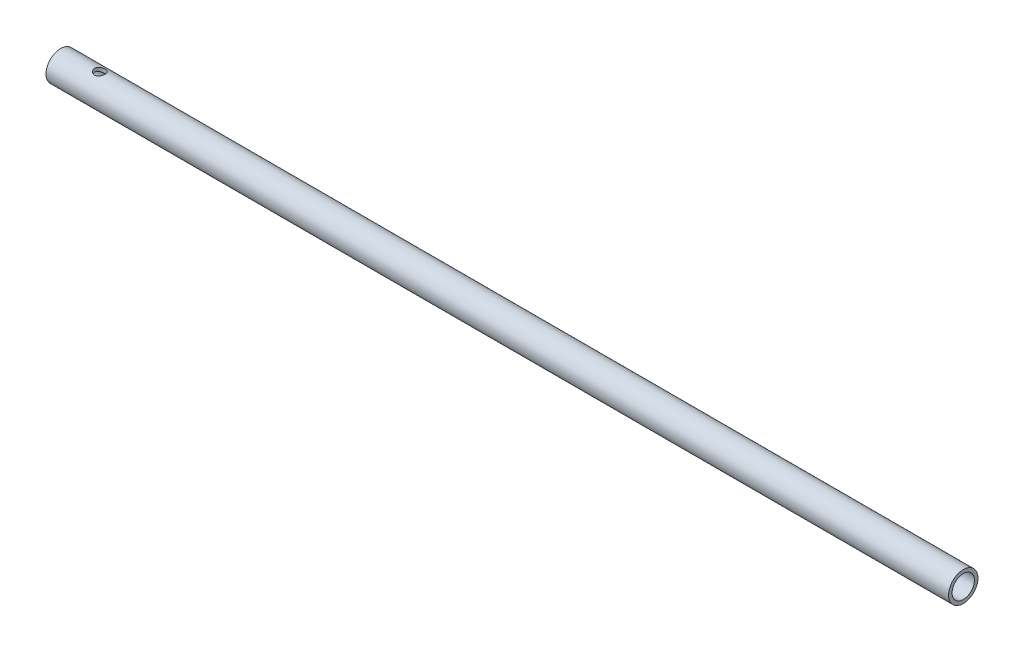
ISO-10303-21;
HEADER;
FILE_DESCRIPTION(('STEP AP214'),'2;1');
FILE_NAME('part.step','',(''),(''),'','','');
FILE_SCHEMA(('AUTOMOTIVE_DESIGN { 1 0 10303 214 1 1 1 1 }'));
ENDSEC;
DATA;
#1=APPLICATION_CONTEXT('core data for automotive mechanical design processes');
#2=APPLICATION_PROTOCOL_DEFINITION('international standard','automotive_design',2000,#1);
#3=PRODUCT_CONTEXT('',#1,'mechanical');
#4=PRODUCT('Part','Part','',(#3));
#5=PRODUCT_RELATED_PRODUCT_CATEGORY('part','',(#4));
#6=PRODUCT_DEFINITION_FORMATION('','',#4);
#7=PRODUCT_DEFINITION_CONTEXT('part definition',#1,'design');
#8=PRODUCT_DEFINITION('design','',#6,#7);
#9=PRODUCT_DEFINITION_SHAPE('','',#8);
#10=(LENGTH_UNIT() NAMED_UNIT(*) SI_UNIT(.MILLI.,.METRE.));
#11=(NAMED_UNIT(*) PLANE_ANGLE_UNIT() SI_UNIT($,.RADIAN.));
#12=(NAMED_UNIT(*) SI_UNIT($,.STERADIAN.) SOLID_ANGLE_UNIT());
#13=UNCERTAINTY_MEASURE_WITH_UNIT(LENGTH_MEASURE(1.E-05),#10,'distance_accuracy_value','');
#14=(GEOMETRIC_REPRESENTATION_CONTEXT(3) GLOBAL_UNCERTAINTY_ASSIGNED_CONTEXT((#13)) GLOBAL_UNIT_ASSIGNED_CONTEXT((#10,
#11,#12)) REPRESENTATION_CONTEXT('',''));
#15=CARTESIAN_POINT('',(0.,0.,0.));
#16=DIRECTION('',(0.,0.,1.));
#17=DIRECTION('',(1.,0.,0.));
#18=AXIS2_PLACEMENT_3D('',#15,#16,#17);
#19=CARTESIAN_POINT('',(0.,38.1,1651.));
#20=DIRECTION('',(0.,1.,0.));
#21=DIRECTION('',(0.,0.,1.));
#22=AXIS2_PLACEMENT_3D('',#19,#20,#21);
#23=CYLINDRICAL_SURFACE('',#22,3.3782);
#24=CARTESIAN_POINT('',(0.,-6.40241249530206,1647.6218));
#25=CARTESIAN_POINT('',(-0.0890182231356904,-6.4024114772284,1647.62179930281));
#26=CARTESIAN_POINT('',(-0.178023174172677,-6.40427612268818,1647.62532381059));
#27=CARTESIAN_POINT('',(-0.355334414158273,-6.41165198846957,1647.63936100384));
#28=CARTESIAN_POINT('',(-0.443640515355418,-6.41716415717875,1647.64987550677));
#29=CARTESIAN_POINT('',(-0.706637929396151,-6.43893164819147,1647.69177560318));
#30=CARTESIAN_POINT('',(-0.879371322870109,-6.4604178390989,1647.7335177177));
#31=CARTESIAN_POINT('',(-1.21372617672372,-6.51435002192829,1647.84247390298));
#32=CARTESIAN_POINT('',(-1.37539269650157,-6.54674794254052,1647.90957640497));
#33=CARTESIAN_POINT('',(-1.68521250562101,-6.6187694143654,1648.06699958884));
#34=CARTESIAN_POINT('',(-1.83336331508836,-6.65839428760147,1648.15732452003));
#35=CARTESIAN_POINT('',(-2.12354646965979,-6.74386605860283,1648.36618407342));
#36=CARTESIAN_POINT('',(-2.26439058488077,-6.78995512153549,1648.48627020436));
#37=CARTESIAN_POINT('',(-2.52484148475974,-6.88119284967937,1648.74799825145));
#38=CARTESIAN_POINT('',(-2.64443987253043,-6.92634113687537,1648.88964864951));
#39=CARTESIAN_POINT('',(-2.86564214450067,-7.01369162959671,1649.20035832633));
#40=CARTESIAN_POINT('',(-2.96583496384141,-7.05558003956582,1649.37051854904));
#41=CARTESIAN_POINT('',(-3.13564095562679,-7.12862072981494,1649.72759712724));
#42=CARTESIAN_POINT('',(-3.20527078811606,-7.15977885722785,1649.9145062857));
#43=CARTESIAN_POINT('',(-3.30743411091863,-7.20611334990599,1650.28722350547));
#44=CARTESIAN_POINT('',(-3.34203805422293,-7.22217704708911,1650.47235134123));
#45=CARTESIAN_POINT('',(-3.3799323413623,-7.23978786303808,1650.84643282893));
#46=CARTESIAN_POINT('',(-3.38323882457513,-7.24134246380426,1651.03538445865));
#47=CARTESIAN_POINT('',(-3.35936440277971,-7.23022400807418,1651.39640335739));
#48=CARTESIAN_POINT('',(-3.33448122883989,-7.21862317514511,1651.56866253696));
#49=CARTESIAN_POINT('',(-3.25897283974304,-7.18405642264455,1651.90622878341));
#50=CARTESIAN_POINT('',(-3.20834577896076,-7.16108968823443,1652.07153535093));
#51=CARTESIAN_POINT('',(-3.08230993256019,-7.1055108861731,1652.39354045546));
#52=CARTESIAN_POINT('',(-3.0065424971096,-7.07275995477103,1652.55007365971));
#53=CARTESIAN_POINT('',(-2.83280097889845,-7.00067158406996,1652.8486038405));
#54=CARTESIAN_POINT('',(-2.7348192604938,-6.96133188125137,1652.99059579441));
#55=CARTESIAN_POINT('',(-2.50980623599016,-6.87592108482548,1653.26887071941));
#56=CARTESIAN_POINT('',(-2.38101431112192,-6.82956205485926,1653.40364416756));
#57=CARTESIAN_POINT('',(-2.10285090636899,-6.73762594728449,1653.65045256351));
#58=CARTESIAN_POINT('',(-1.9534628597546,-6.69204953270743,1653.76246902522));
#59=CARTESIAN_POINT('',(-1.62890714372979,-6.60444901178298,1653.96602503103));
#60=CARTESIAN_POINT('',(-1.45282088476728,-6.56271877770001,1654.05625164757));
#61=CARTESIAN_POINT('',(-1.17769998769004,-6.50920390152831,1654.16781846068));
#62=CARTESIAN_POINT('',(-1.08420445411623,-6.4928841844046,1654.2010358619));
#63=CARTESIAN_POINT('',(-0.894150738749333,-6.46386819791863,1654.25923129239));
#64=CARTESIAN_POINT('',(-0.797593940503992,-6.45117031688186,1654.28421298723));
#65=CARTESIAN_POINT('',(-0.585379644144447,-6.42811084754546,1654.3291537489));
#66=CARTESIAN_POINT('',(-0.46929344303718,-6.41852679421297,1654.34750978705));
#67=CARTESIAN_POINT('',(-0.235487795466039,-6.40567920976522,1654.37203070072));
#68=CARTESIAN_POINT('',(-0.117768482236644,-6.4024151660622,1654.37819656491));
#69=CARTESIAN_POINT('',(0.0889454878829048,-6.40241047603113,1654.37820259672));
#70=CARTESIAN_POINT('',(0.177949990650594,-6.40427409371192,1654.37468003527));
#71=CARTESIAN_POINT('',(0.355260537169802,-6.4116478981037,1654.36064679415));
#72=CARTESIAN_POINT('',(0.443566393140602,-6.41715903360271,1654.35013429626));
#73=CARTESIAN_POINT('',(0.706563429303057,-6.43892347541832,1654.30824026182));
#74=CARTESIAN_POINT('',(0.879296992653557,-6.46040770104194,1654.26650225035));
#75=CARTESIAN_POINT('',(1.21365289602068,-6.51433634811935,1654.15755422231));
#76=CARTESIAN_POINT('',(1.3753202921554,-6.54673269680403,1654.09045577415));
#77=CARTESIAN_POINT('',(1.68514244277596,-6.61875154129532,1653.93304061995));
#78=CARTESIAN_POINT('',(1.83329471836724,-6.65837535875651,1653.84271966608));
#79=CARTESIAN_POINT('',(2.12348115605627,-6.74384545222831,1653.63386849069));
#80=CARTESIAN_POINT('',(2.26432717009804,-6.78993392833558,1653.51378680661));
#81=CARTESIAN_POINT('',(2.52478264649505,-6.88117121606891,1653.25206759033));
#82=CARTESIAN_POINT('',(2.64438371120595,-6.92631964992036,1653.11042157514));
#83=CARTESIAN_POINT('',(2.86559337614741,-7.01367164084359,1652.79971931923));
#84=CARTESIAN_POINT('',(2.96579072863358,-7.05556139620862,1652.62956194017));
#85=CARTESIAN_POINT('',(3.13560629410022,-7.12860543513074,1652.2724882653));
#86=CARTESIAN_POINT('',(3.20524116470578,-7.15976556471006,1652.08558116574));
#87=CARTESIAN_POINT('',(3.30741496151167,-7.20610453159711,1651.71286566266));
#88=CARTESIAN_POINT('',(3.34202410792714,-7.22217058328132,1651.5277374789));
#89=CARTESIAN_POINT('',(3.37992845904045,-7.2397860400527,1651.15365425381));
#90=CARTESIAN_POINT('',(3.38323980514377,-7.24134292803359,1650.9647012355));
#91=CARTESIAN_POINT('',(3.35937422398175,-7.23022857662034,1650.60367962604));
#92=CARTESIAN_POINT('',(3.33449520039526,-7.21862964557001,1650.43141917997));
#93=CARTESIAN_POINT('',(3.25899471010991,-7.18406636045632,1650.09384973896));
#94=CARTESIAN_POINT('',(3.20837139840831,-7.16110119181777,1649.92854124316));
#95=CARTESIAN_POINT('',(3.08234312061693,-7.10552531304874,1649.60653302871));
#96=CARTESIAN_POINT('',(3.0065796885234,-7.07277580640752,1649.44999854753));
#97=CARTESIAN_POINT('',(2.83284601241975,-7.00068984937467,1649.15146522868));
#98=CARTESIAN_POINT('',(2.73486813312654,-6.96135113543713,1649.00947141315));
#99=CARTESIAN_POINT('',(2.50986314427501,-6.87594192460522,1648.73119232435));
#100=CARTESIAN_POINT('',(2.38107544361919,-6.82958345100158,1648.59641648987));
#101=CARTESIAN_POINT('',(2.10292033459826,-6.73764770115197,1648.3496026122));
#102=CARTESIAN_POINT('',(1.95353636040185,-6.69207108728318,1648.23758305337));
#103=CARTESIAN_POINT('',(1.62898752643711,-6.60446891707103,1648.03401912359));
#104=CARTESIAN_POINT('',(1.4529039221055,-6.56273723202822,1647.94378784071));
#105=CARTESIAN_POINT('',(1.17778635660624,-6.50921954728783,1647.83221365303));
#106=CARTESIAN_POINT('',(1.08429180010921,-6.49289878626286,1647.79899372694));
#107=CARTESIAN_POINT('',(0.894239800082703,-6.46388053271418,1647.74079314337));
#108=CARTESIAN_POINT('',(0.79768373979328,-6.45118142907084,1647.71580882144));
#109=CARTESIAN_POINT('',(0.585444089015158,-6.4281162652885,1647.67085662912));
#110=CARTESIAN_POINT('',(0.469331004375973,-6.41852904420263,1647.65249451297));
#111=CARTESIAN_POINT('',(0.235470786825586,-6.40567808930858,1647.62796715496));
#112=CARTESIAN_POINT('',(0.117723787475579,-6.40241384167232,1647.62180092202));
#113=CARTESIAN_POINT('',(0.,-6.40241249530206,1647.6218));
#114=B_SPLINE_CURVE_WITH_KNOTS('',3,(#24,#25,#26,#27,#28,#29,#30,#31,#32,#33,#34,#35,#36,#37,
#38,#39,#40,#41,#42,#43,#44,#45,#46,#47,#48,#49,#50,#51,#52,#53,#54,#55,#56,#57,#58,#59,#60,#61,
#62,#63,#64,#65,#66,#67,#68,#69,#70,#71,#72,#73,#74,#75,#76,#77,#78,#79,#80,#81,#82,#83,#84,#85,
#86,#87,#88,#89,#90,#91,#92,#93,#94,#95,#96,#97,#98,#99,#100,#101,#102,#103,#104,#105,#106,#107,
#108,#109,#110,#111,#112,#113),.UNSPECIFIED.,.T.,.F.,(4,2,2,2,2,2,2,2,2,2,2,2,2,2,2,2,2,2,2,2,2,
2,2,2,2,2,2,2,2,2,2,2,2,2,2,2,2,2,2,2,2,2,2,2,4),(0.,0.266933265262493,0.5339359627666,
1.06805089366104,1.5998429228037,2.13173233018922,2.70152261694857,3.27153760165676,
3.8739858017796,4.47610519515429,5.04008373808632,5.60377143444725,6.12462285485295,
6.64551162129325,7.17417599678178,7.70302236461894,8.27679174174632,8.851025359182,
9.45413436904528,9.75542508148455,10.0565815131846,10.4095385806866,10.7624670202174,
11.0293986337968,11.2963997086156,11.8305115576375,12.3623005288776,12.8941868436374,
13.463972562088,14.0339830050815,14.6364316398815,15.2385515100333,15.8025344895565,
16.3662265868162,16.8870795653455,17.4079698768403,17.9366317104741,18.465475525604,
19.0392410668035,19.6134708163458,20.2165800995581,20.5178710990919,20.8190278573977,
21.1720673571715,21.5250781664529),.UNSPECIFIED.);
#115=CARTESIAN_POINT('',(0.,-6.40241249530206,1647.6218));
#116=VERTEX_POINT('',#115);
#117=EDGE_CURVE('E19',#116,#116,#114,.T.);
#118=ORIENTED_EDGE('',*,*,#117,.T.);
#119=EDGE_LOOP('',(#118));
#120=FACE_BOUND('',#119,.T.);
#121=CARTESIAN_POINT('',(0.,-8.90580651934456,1647.6218));
#122=CARTESIAN_POINT('',(-0.0915207493424671,-8.90580687149875,1647.62180056287));
#123=CARTESIAN_POINT('',(-0.183043326598945,-8.90722275509623,1647.62552482583));
#124=CARTESIAN_POINT('',(-0.36541074103425,-8.91283226406706,1647.64037247911));
#125=CARTESIAN_POINT('',(-0.456255307593295,-8.91702694426764,1647.65149867921));
#126=CARTESIAN_POINT('',(-0.726969336052,-8.93362069475261,1647.69589157635));
#127=CARTESIAN_POINT('',(-0.904923491342517,-8.95002927975293,1647.74017244301));
#128=CARTESIAN_POINT('',(-1.24982725086556,-8.99144530734925,1647.85623559238));
#129=CARTESIAN_POINT('',(-1.4168062732305,-9.01642854402305,1647.92794052243));
#130=CARTESIAN_POINT('',(-1.7363999498689,-9.0721387993984,1648.09659033487));
#131=CARTESIAN_POINT('',(-1.88901528181563,-9.10286554691892,1648.19353402567));
#132=CARTESIAN_POINT('',(-2.18236541650468,-9.16814057165193,1648.41454111693));
#133=CARTESIAN_POINT('',(-2.32236988224442,-9.20279315786763,1648.53954293788));
#134=CARTESIAN_POINT('',(-2.57994202723861,-9.27114039963637,1648.81112604522));
#135=CARTESIAN_POINT('',(-2.69750447981808,-9.30483483048679,1648.95771234452));
#136=CARTESIAN_POINT('',(-2.91024472653548,-9.36868652326264,1649.2737175879));
#137=CARTESIAN_POINT('',(-3.00464634413195,-9.39870756593504,1649.4436890257));
#138=CARTESIAN_POINT('',(-3.16322126523479,-9.45059347978661,1649.7983497467));
#139=CARTESIAN_POINT('',(-3.22740395009737,-9.47246088179424,1649.98303444138));
#140=CARTESIAN_POINT('',(-3.32120959840133,-9.50483860349646,1650.35423903012));
#141=CARTESIAN_POINT('',(-3.35208228501743,-9.51575843098858,1650.54040671194));
#142=CARTESIAN_POINT('',(-3.38238054486757,-9.52647223289373,1650.91557916461));
#143=CARTESIAN_POINT('',(-3.38181527943837,-9.52626944854844,1651.10458309289));
#144=CARTESIAN_POINT('',(-3.35001411590817,-9.51502996938617,1651.47116121887));
#145=CARTESIAN_POINT('',(-3.32013892714645,-9.50447392949925,1651.64887068097));
#146=CARTESIAN_POINT('',(-3.23283542832104,-9.47433087868727,1651.99656788003));
#147=CARTESIAN_POINT('',(-3.17540510266842,-9.45474320712517,1652.16655505113));
#148=CARTESIAN_POINT('',(-3.03390758911372,-9.40816014206071,1652.49678558165));
#149=CARTESIAN_POINT('',(-2.94947967165509,-9.38106513455802,1652.65685974895));
#150=CARTESIAN_POINT('',(-2.75669844868793,-9.32225082261101,1652.96093961409));
#151=CARTESIAN_POINT('',(-2.6483390581836,-9.29053034275756,1653.10494121115));
#152=CARTESIAN_POINT('',(-2.40406580060182,-9.22379710345894,1653.38084010188));
#153=CARTESIAN_POINT('',(-2.26700075126949,-9.18869893787227,1653.51169955307));
#154=CARTESIAN_POINT('',(-1.9726020660726,-9.12052800170189,1653.74897615972));
#155=CARTESIAN_POINT('',(-1.81525794844245,-9.08745629167944,1653.85538059524));
#156=CARTESIAN_POINT('',(-1.48083507256429,-9.02656548043368,1654.04247672514));
#157=CARTESIAN_POINT('',(-1.30344249011491,-8.99885607793933,1654.12265079404));
#158=CARTESIAN_POINT('',(-1.02855543565786,-8.9645407952887,1654.2192812088));
#159=CARTESIAN_POINT('',(-0.935503609614875,-8.95431345888475,1654.24754553709));
#160=CARTESIAN_POINT('',(-0.747076535308155,-8.93659582381654,1654.29599058897));
#161=CARTESIAN_POINT('',(-0.651702369756042,-8.92910427479281,1654.31617500581));
#162=CARTESIAN_POINT('',(-0.46393492851279,-8.91741319392304,1654.34748127864));
#163=CARTESIAN_POINT('',(-0.371613732976367,-8.9130748402957,1654.35898627579));
#164=CARTESIAN_POINT('',(-0.186243847094462,-8.90727207326498,1654.37434394635));
#165=CARTESIAN_POINT('',(-0.0931951543429634,-8.90580766937052,1654.37819659443));
#166=CARTESIAN_POINT('',(0.0913757435937301,-8.90580539055733,1654.37820334343));
#167=CARTESIAN_POINT('',(0.182897880074852,-8.90721977010388,1654.37448304397));
#168=CARTESIAN_POINT('',(0.36526479010675,-8.91282628299782,1654.35964337739));
#169=CARTESIAN_POINT('',(0.456109293031907,-8.91701947173168,1654.34852119905));
#170=CARTESIAN_POINT('',(0.726823816623503,-8.93360884420055,1654.30414038453));
#171=CARTESIAN_POINT('',(0.904779091351295,-8.95001464041329,1654.25986759213));
#172=CARTESIAN_POINT('',(1.24968642310294,-8.99142569339423,1654.14382034197));
#173=CARTESIAN_POINT('',(1.41666789581119,-9.01640674144964,1654.07212324108));
#174=CARTESIAN_POINT('',(1.73626764924811,-9.07211341923259,1653.90348872837));
#175=CARTESIAN_POINT('',(1.88888661014376,-9.10283877672024,1653.80655251261));
#176=CARTESIAN_POINT('',(2.18224500014065,-9.16811183849284,1653.58556041875));
#177=CARTESIAN_POINT('',(2.32225417477182,-9.20276388445466,1653.46056614814));
#178=CARTESIAN_POINT('',(2.57983702155133,-9.27111110500754,1653.18899758037));
#179=CARTESIAN_POINT('',(2.6974054652843,-9.30480605505424,1653.04241826821));
#180=CARTESIAN_POINT('',(2.91016019531257,-9.3686601796353,1652.72642490934));
#181=CARTESIAN_POINT('',(3.00457009281052,-9.39868312300069,1652.55645816548));
#182=CARTESIAN_POINT('',(3.16316232835591,-9.45057368687565,1652.20180537532));
#183=CARTESIAN_POINT('',(3.22735404584484,-9.47244383749691,1652.01712391717));
#184=CARTESIAN_POINT('',(3.32117823206512,-9.50482760341192,1651.64592265492));
#185=CARTESIAN_POINT('',(3.35206018510083,-9.51575063349633,1651.45975506723));
#186=CARTESIAN_POINT('',(3.38237662441227,-9.526470828054,1651.08458107184));
#187=CARTESIAN_POINT('',(3.3818202738065,-9.52627123436653,1650.89557550736));
#188=CARTESIAN_POINT('',(3.35003592438134,-9.51503765942138,1650.52899364076));
#189=CARTESIAN_POINT('',(3.32016882686283,-9.50448440606883,1650.35128212673));
#190=CARTESIAN_POINT('',(3.23288090641914,-9.47434642859258,1650.00357953423));
#191=CARTESIAN_POINT('',(3.17545806908137,-9.45476104419534,1649.83358902119));
#192=CARTESIAN_POINT('',(3.03397550195615,-9.40818209653796,1649.50335218311));
#193=CARTESIAN_POINT('',(2.94955526634951,-9.3810889742906,1649.34327492551));
#194=CARTESIAN_POINT('',(2.75678895570377,-9.32227765937115,1649.03918770886));
#195=CARTESIAN_POINT('',(2.64843679530243,-9.29055829104446,1648.89518185045));
#196=CARTESIAN_POINT('',(2.40417790042267,-9.22382641914735,1648.61927319057));
#197=CARTESIAN_POINT('',(2.26711996904141,-9.18872846122231,1648.48840815984));
#198=CARTESIAN_POINT('',(1.97273482194872,-9.12055682588464,1648.25111920405));
#199=CARTESIAN_POINT('',(1.81539712646015,-9.08748420821397,1648.14470799545));
#200=CARTESIAN_POINT('',(1.4809846625129,-9.02659011121323,1647.95759607418));
#201=CARTESIAN_POINT('',(1.30359589026201,-8.99887836520897,1647.87741323002));
#202=CARTESIAN_POINT('',(1.02871327129074,-8.9645589232538,1647.7807692197));
#203=CARTESIAN_POINT('',(0.935662671903101,-8.95433009128763,1647.75250028313));
#204=CARTESIAN_POINT('',(0.74723761443485,-8.93660930248198,1647.70404591911));
#205=CARTESIAN_POINT('',(0.651864238734405,-8.9291160959589,1647.68385680026));
#206=CARTESIAN_POINT('',(0.464047427964192,-8.91741853885669,1647.65253289081));
#207=CARTESIAN_POINT('',(0.371675316145173,-8.91307687449024,1647.64101911039));
#208=CARTESIAN_POINT('',(0.186202768332251,-8.90727068096301,1647.6256523663));
#209=CARTESIAN_POINT('',(0.0931023299844654,-8.90580616110474,1647.6217994274));
#210=CARTESIAN_POINT('',(0.,-8.90580651934456,1647.6218));
#211=B_SPLINE_CURVE_WITH_KNOTS('',3,(#121,#122,#123,#124,#125,#126,#127,#128,#129,#130,#131,
#132,#133,#134,#135,#136,#137,#138,#139,#140,#141,#142,#143,#144,#145,#146,#147,#148,#149,#150,
#151,#152,#153,#154,#155,#156,#157,#158,#159,#160,#161,#162,#163,#164,#165,#166,#167,#168,#169,
#170,#171,#172,#173,#174,#175,#176,#177,#178,#179,#180,#181,#182,#183,#184,#185,#186,#187,#188,
#189,#190,#191,#192,#193,#194,#195,#196,#197,#198,#199,#200,#201,#202,#203,#204,#205,#206,#207,
#208,#209,#210),.UNSPECIFIED.,.T.,.F.,(4,2,2,2,2,2,2,2,2,2,2,2,2,2,2,2,2,2,2,2,2,2,2,2,2,2,2,2,
2,2,2,2,2,2,2,2,2,2,2,2,2,2,2,2,4),(0.,0.274468657858002,0.549041563374095,1.09847046497821,
1.64636093546196,2.1942255437174,2.76425263237227,3.33441231702457,3.92165413944633,
4.50871353440741,5.07288722887746,5.63689651829612,6.17590383840126,6.71495059154787,
7.26152396780653,7.80823648024185,8.3837609722139,8.9595841410704,9.54616722548127,
9.83919692485865,10.1320925303455,10.4111488954285,10.6902061838122,10.9646729405918,
11.2392439991148,11.7886695778305,12.3365566636688,12.8844177900897,13.4544401678119,
14.0245951920859,14.6118376744218,15.1988977617835,15.7630762277696,16.327090257165,
16.8660990877332,17.4051473275726,17.9517173530777,18.4984265196514,19.0739471312366,
19.649766350424,20.2363508928573,20.5293815504065,20.8222781782093,21.1014890578947,
21.3807008403362),.UNSPECIFIED.);
#212=CARTESIAN_POINT('',(0.,-8.90580651934456,1647.6218));
#213=VERTEX_POINT('',#212);
#214=EDGE_CURVE('E46',#213,#213,#211,.T.);
#215=ORIENTED_EDGE('',*,*,#214,.F.);
#216=EDGE_LOOP('',(#215));
#217=FACE_BOUND('',#216,.T.);
#218=ADVANCED_FACE('F15',(#120,#217),#23,.F.);
#219=CARTESIAN_POINT('',(558.8,0.,1651.));
#220=DIRECTION('',(1.,0.,0.));
#221=DIRECTION('',(0.,0.,-1.));
#222=AXIS2_PLACEMENT_3D('',#219,#220,#221);
#223=CYLINDRICAL_SURFACE('',#222,7.239);
#224=CARTESIAN_POINT('',(558.8,0.,1651.));
#225=DIRECTION('',(1.,0.,0.));
#226=DIRECTION('',(0.,0.,-1.));
#227=AXIS2_PLACEMENT_3D('',#224,#225,#226);
#228=CIRCLE('',#227,7.239);
#229=CARTESIAN_POINT('',(558.8,0.,1643.761));
#230=VERTEX_POINT('',#229);
#231=EDGE_CURVE('E52',#230,#230,#228,.F.);
#232=ORIENTED_EDGE('',*,*,#231,.F.);
#233=EDGE_LOOP('',(#232));
#234=FACE_BOUND('',#233,.T.);
#235=CARTESIAN_POINT('',(7.21948110320981E-05,6.40241250737723,1654.37820001858));
#236=CARTESIAN_POINT('',(0.0890909398934657,6.40241249210177,1654.37819881125));
#237=CARTESIAN_POINT('',(0.178096317989105,6.40427815529703,1654.37467234748));
#238=CARTESIAN_POINT('',(0.35540821366055,6.41165607200772,1654.3606312003));
#239=CARTESIAN_POINT('',(0.443714543410932,6.41716927402387,1654.35011469922));
#240=CARTESIAN_POINT('',(0.706712362202597,6.43893981584678,1654.3082085494));
#241=CARTESIAN_POINT('',(0.879445630643445,6.46042797463861,1654.26646232148));
#242=CARTESIAN_POINT('',(1.21379948537585,6.51436370078216,1654.15749795897));
#243=CARTESIAN_POINT('',(1.37546513634944,6.54676319614647,1654.09039139845));
#244=CARTESIAN_POINT('',(1.68528260221654,6.61878729712518,1653.93296018041));
#245=CARTESIAN_POINT('',(1.83343193761739,6.65841322440596,1653.84263127443));
#246=CARTESIAN_POINT('',(2.12361179984516,6.74388667074686,1653.6337633463));
#247=CARTESIAN_POINT('',(2.26445401432698,6.78997632016535,1653.51367276848));
#248=CARTESIAN_POINT('',(2.52490033636585,6.88121448862966,1653.25193588852));
#249=CARTESIAN_POINT('',(2.64449604741587,6.92636262940267,1653.11028110521));
#250=CARTESIAN_POINT('',(2.86569092495601,7.01371162358806,1652.79956400417));
#251=CARTESIAN_POINT('',(2.96587920974253,7.05559868765651,1652.62940093711));
#252=CARTESIAN_POINT('',(3.13567562477539,7.12863602800188,1652.27231745472));
#253=CARTESIAN_POINT('',(3.20530041753191,7.15979215253867,1652.08540623721));
#254=CARTESIAN_POINT('',(3.30745326329907,7.20612216962408,1651.71268730086));
#255=CARTESIAN_POINT('',(3.34205200207985,7.22218351164029,1651.52755981332));
#256=CARTESIAN_POINT('',(3.37993622252239,7.23978968548295,1651.15348006382));
#257=CARTESIAN_POINT('',(3.38323784155636,7.24134199842664,1650.96452982331));
#258=CARTESIAN_POINT('',(3.35935457678558,7.23021943730834,1650.60351363617));
#259=CARTESIAN_POINT('',(3.33446725134296,7.21861670199009,1650.43125572336));
#260=CARTESIAN_POINT('',(3.25895096124544,7.18404648119122,1650.09369267235));
#261=CARTESIAN_POINT('',(3.20832015037493,7.16107818062275,1649.92838803375));
#262=CARTESIAN_POINT('',(3.08227673374635,7.10549645474852,1649.60638604137));
#263=CARTESIAN_POINT('',(3.00650529445892,7.07274409850813,1649.44985411561));
#264=CARTESIAN_POINT('',(2.83275593217144,7.00065331364771,1649.15132707363));
#265=CARTESIAN_POINT('',(2.734770372825,6.96131262143329,1649.00933698075));
#266=CARTESIAN_POINT('',(2.50974930407228,6.87590023671048,1648.73106621309));
#267=CARTESIAN_POINT('',(2.38095314729437,6.82954064805566,1648.59629514623));
#268=CARTESIAN_POINT('',(2.10278144227675,6.73760418299139,1648.34949223597));
#269=CARTESIAN_POINT('',(1.95338932832966,6.69202797019127,1648.23747887825));
#270=CARTESIAN_POINT('',(1.62882677665429,6.60442911201426,1648.03393082861));
#271=CARTESIAN_POINT('',(1.45273790837097,6.56270033862006,1647.94370889819));
#272=CARTESIAN_POINT('',(1.17761370874306,6.50918827317285,1647.83214946146));
#273=CARTESIAN_POINT('',(1.08411718053698,6.49286959612618,1647.79893457659));
#274=CARTESIAN_POINT('',(0.894061711527615,6.46385586815329,1647.74074428239));
#275=CARTESIAN_POINT('',(0.797504154221459,6.45115920541067,1647.71576520731));
#276=CARTESIAN_POINT('',(0.585291781753734,6.42810288834936,1647.67083091815));
#277=CARTESIAN_POINT('',(0.469208405238369,6.41852063147576,1647.65247841121));
#278=CARTESIAN_POINT('',(0.235408873458949,6.40567636279113,1647.62796390606));
#279=CARTESIAN_POINT('',(0.117692851355724,6.40241383855172,1647.62180091947));
#280=CARTESIAN_POINT('',(-0.0890181859087606,6.40241147932151,1647.62179930455));
#281=CARTESIAN_POINT('',(-0.178023116279669,6.40427612210208,1647.62532380887));
#282=CARTESIAN_POINT('',(-0.355334318964812,6.41165198268433,1647.63936099343));
#283=CARTESIAN_POINT('',(-0.44364040342737,6.41716414936917,1647.64987549207));
#284=CARTESIAN_POINT('',(-0.706637843808546,6.43893163822423,1647.69177558332));
#285=CARTESIAN_POINT('',(-0.879371281818471,6.46041783267846,1647.73351770458));
#286=CARTESIAN_POINT('',(-1.21372618544514,6.51435002313466,1647.84247390556));
#287=CARTESIAN_POINT('',(-1.37539271247424,6.54674794568545,1647.90957641152));
#288=CARTESIAN_POINT('',(-1.6852125199767,6.6187694182719,1648.0669995977));
#289=CARTESIAN_POINT('',(-1.83336332189755,6.65839428962634,1648.15732452496));
#290=CARTESIAN_POINT('',(-2.12354646847152,6.74386605823219,1648.36618407253));
#291=CARTESIAN_POINT('',(-2.26439058259858,6.78995512078304,1648.4862702024));
#292=CARTESIAN_POINT('',(-2.52484148280648,6.88119284894797,1648.74799824915));
#293=CARTESIAN_POINT('',(-2.6444398716548,6.92634113653131,1648.88964864828));
#294=CARTESIAN_POINT('',(-2.86564214455637,7.01369162961689,1649.2003583264));
#295=CARTESIAN_POINT('',(-2.96583496393329,7.05558003960367,1649.3705185492));
#296=CARTESIAN_POINT('',(-3.13564095568884,7.12862072984329,1649.72759712741));
#297=CARTESIAN_POINT('',(-3.20527078813966,7.15977885723873,1649.91450628579));
#298=CARTESIAN_POINT('',(-3.30743411093994,7.20611334991549,1650.28722350554));
#299=CARTESIAN_POINT('',(-3.34203805425257,7.22217704710275,1650.47235134138));
#300=CARTESIAN_POINT('',(-3.37993234136521,7.23978786303958,1650.84643282909));
#301=CARTESIAN_POINT('',(-3.38323882456971,7.24134246380186,1651.03538445873));
#302=CARTESIAN_POINT('',(-3.35936440277157,7.23022400807028,1651.39640335752));
#303=CARTESIAN_POINT('',(-3.3344812288046,7.21862317512835,1651.56866253721));
#304=CARTESIAN_POINT('',(-3.25897283966935,7.18405642261142,1651.90622878365));
#305=CARTESIAN_POINT('',(-3.20834577891285,7.16108968821416,1652.07153535104));
#306=CARTESIAN_POINT('',(-3.08230993307316,7.10551088639843,1652.39354045416));
#307=CARTESIAN_POINT('',(-3.006542498338,7.0727599552989,1652.55007365719));
#308=CARTESIAN_POINT('',(-2.83280098046988,7.00067158470375,1652.84860383821));
#309=CARTESIAN_POINT('',(-2.7348192613364,6.96133188158287,1652.99059579332));
#310=CARTESIAN_POINT('',(-2.50980623041918,6.87592108269817,1653.26887072634));
#311=CARTESIAN_POINT('',(-2.38101429891527,6.82956205041804,1653.40364418048));
#312=CARTESIAN_POINT('',(-2.1028508919031,6.73762594291088,1653.65045257426));
#313=CARTESIAN_POINT('',(-1.95346285162241,6.69204953063719,1653.76246902998));
#314=CARTESIAN_POINT('',(-1.62890718409155,6.60444902254599,1653.96602500607));
#315=CARTESIAN_POINT('',(-1.45282097123689,6.56271879776529,1654.05625160437));
#316=CARTESIAN_POINT('',(-1.17770010380363,6.50920392248513,1654.16781841767));
#317=CARTESIAN_POINT('',(-1.08420455258174,6.49288420098848,1654.20103582806));
#318=CARTESIAN_POINT('',(-0.894150798786629,6.46386820553671,1654.25923127769));
#319=CARTESIAN_POINT('',(-0.797593979407288,6.45117032031471,1654.28421298157));
#320=CARTESIAN_POINT('',(-0.58535624469905,6.4281083058639,1654.32915870119));
#321=CARTESIAN_POINT('',(-0.469245976742931,6.41852287806132,1654.34751728269));
#322=CARTESIAN_POINT('',(-0.235391859865013,6.40567524576271,1654.37203824428));
#323=CARTESIAN_POINT('',(-0.11764814443562,6.40241252757784,1654.37820161517));
#324=CARTESIAN_POINT('',(7.21948110320981E-05,6.40241250737723,1654.37820001858));
#325=B_SPLINE_CURVE_WITH_KNOTS('',3,(#235,#236,#237,#238,#239,#240,#241,#242,#243,#244,#245,
#246,#247,#248,#249,#250,#251,#252,#253,#254,#255,#256,#257,#258,#259,#260,#261,#262,#263,#264,
#265,#266,#267,#268,#269,#270,#271,#272,#273,#274,#275,#276,#277,#278,#279,#280,#281,#282,#283,
#284,#285,#286,#287,#288,#289,#290,#291,#292,#293,#294,#295,#296,#297,#298,#299,#300,#301,#302,
#303,#304,#305,#306,#307,#308,#309,#310,#311,#312,#313,#314,#315,#316,#317,#318,#319,#320,#321,
#322,#323,#324),.UNSPECIFIED.,.T.,.F.,(4,2,2,2,2,2,2,2,2,2,2,2,2,2,2,2,2,2,2,2,2,2,2,2,2,2,2,2,
2,2,2,2,2,2,2,2,2,2,2,2,2,2,2,2,4),(0.,0.266934833403639,0.533939107451154,1.06805725155043,
1.59985236744558,2.13174484285413,2.70153969399102,3.27155922656414,3.87400699181319,
4.47612590730898,5.04010001258391,5.60378330658014,6.12463316909765,6.64552039006876,
7.17418730431667,7.70303622990141,8.27680947088601,8.85104693031551,9.45415552292331,
9.75544600254015,10.05660219633,10.4095488970267,10.7624669782404,11.0294001606908,
11.2964028116453,11.8305178715451,12.3623099266341,12.8941993080677,13.4639895902077,
14.034004579535,14.6364527799298,15.2385721730326,15.8025507162054,16.3662384123256,
16.8870898331059,17.4079785991716,17.9366429704132,18.465489342498,19.0392587470533,
19.613492337062,20.2166012026881,20.5178919704585,20.819048491488,21.1720776478421,
21.5250781211236),.UNSPECIFIED.);
#326=CARTESIAN_POINT('',(7.21948110320981E-05,6.40241250737723,1654.37820001858));
#327=VERTEX_POINT('',#326);
#328=EDGE_CURVE('E76',#327,#327,#325,.T.);
#329=ORIENTED_EDGE('',*,*,#328,.T.);
#330=EDGE_LOOP('',(#329));
#331=FACE_BOUND('',#330,.T.);
#332=CARTESIAN_POINT('',(-25.4,0.,1651.));
#333=DIRECTION('',(1.,0.,0.));
#334=DIRECTION('',(0.,0.,-1.));
#335=AXIS2_PLACEMENT_3D('',#332,#333,#334);
#336=CIRCLE('',#335,7.239);
#337=CARTESIAN_POINT('',(-25.4,0.,1643.761));
#338=VERTEX_POINT('',#337);
#339=EDGE_CURVE('E51',#338,#338,#336,.F.);
#340=ORIENTED_EDGE('',*,*,#339,.T.);
#341=EDGE_LOOP('',(#340));
#342=FACE_BOUND('',#341,.T.);
#343=ORIENTED_EDGE('',*,*,#117,.F.);
#344=EDGE_LOOP('',(#343));
#345=FACE_BOUND('',#344,.T.);
#346=ADVANCED_FACE('F62',(#234,#331,#342,#345),#223,.F.);
#347=CARTESIAN_POINT('',(558.8,0.,1905.));
#348=DIRECTION('',(1.,0.,0.));
#349=DIRECTION('',(0.,0.,-1.));
#350=AXIS2_PLACEMENT_3D('',#347,#348,#349);
#351=PLANE('',#350);
#352=ORIENTED_EDGE('',*,*,#231,.T.);
#353=EDGE_LOOP('',(#352));
#354=FACE_BOUND('',#353,.T.);
#355=CARTESIAN_POINT('',(558.8,0.,1651.));
#356=DIRECTION('',(1.,0.,0.));
#357=DIRECTION('',(0.,0.,-1.));
#358=AXIS2_PLACEMENT_3D('',#355,#356,#357);
#359=CIRCLE('',#358,9.525);
#360=CARTESIAN_POINT('',(558.8,0.,1641.475));
#361=VERTEX_POINT('',#360);
#362=EDGE_CURVE('E30',#361,#361,#359,.F.);
#363=ORIENTED_EDGE('',*,*,#362,.F.);
#364=EDGE_LOOP('',(#363));
#365=FACE_BOUND('',#364,.T.);
#366=ADVANCED_FACE('F64',(#354,#365),#351,.T.);
#367=CARTESIAN_POINT('',(-25.4,0.,1905.));
#368=DIRECTION('',(1.,0.,0.));
#369=DIRECTION('',(0.,0.,-1.));
#370=AXIS2_PLACEMENT_3D('',#367,#368,#369);
#371=PLANE('',#370);
#372=ORIENTED_EDGE('',*,*,#339,.F.);
#373=EDGE_LOOP('',(#372));
#374=FACE_BOUND('',#373,.T.);
#375=CARTESIAN_POINT('',(-25.4,0.,1651.));
#376=DIRECTION('',(1.,0.,0.));
#377=DIRECTION('',(0.,0.,-1.));
#378=AXIS2_PLACEMENT_3D('',#375,#376,#377);
#379=CIRCLE('',#378,9.525);
#380=CARTESIAN_POINT('',(-25.4,0.,1641.475));
#381=VERTEX_POINT('',#380);
#382=EDGE_CURVE('E25',#381,#381,#379,.T.);
#383=ORIENTED_EDGE('',*,*,#382,.F.);
#384=EDGE_LOOP('',(#383));
#385=FACE_BOUND('',#384,.T.);
#386=ADVANCED_FACE('F71',(#374,#385),#371,.F.);
#387=CARTESIAN_POINT('',(0.,38.1,1651.));
#388=DIRECTION('',(0.,1.,0.));
#389=DIRECTION('',(0.,0.,1.));
#390=AXIS2_PLACEMENT_3D('',#387,#388,#389);
#391=CYLINDRICAL_SURFACE('',#390,3.3782);
#392=ORIENTED_EDGE('',*,*,#328,.F.);
#393=EDGE_LOOP('',(#392));
#394=FACE_BOUND('',#393,.T.);
#395=CARTESIAN_POINT('',(0.000144388852038666,8.90580652051503,1654.37819999691));
#396=CARTESIAN_POINT('',(-0.091375710622921,8.90580539022063,1654.37820334432));
#397=CARTESIAN_POINT('',(-0.182897847008367,8.90721976942542,1654.37448304576));
#398=CARTESIAN_POINT('',(-0.365264756933903,8.9128262816387,1654.359643381));
#399=CARTESIAN_POINT('',(-0.456109259848393,8.91701947003373,1654.34852120356));
#400=CARTESIAN_POINT('',(-0.726823783546829,8.93360884150731,1654.30414039179));
#401=CARTESIAN_POINT('',(-0.90477905851936,8.95001463708518,1654.25986760123));
#402=CARTESIAN_POINT('',(-1.2496863910721,8.9914256889334,1654.14382035469));
#403=CARTESIAN_POINT('',(-1.41666786433574,9.01640673649068,1654.07212325559));
#404=CARTESIAN_POINT('',(-1.73626761915506,9.07211341345979,1653.90348874635));
#405=CARTESIAN_POINT('',(-1.88888658087795,9.10283877063164,1653.80655253229));
#406=CARTESIAN_POINT('',(-2.18224497275428,9.16811183195821,1653.58556044184));
#407=CARTESIAN_POINT('',(-2.3222541484566,9.2027638777972,1653.46056617295));
#408=CARTESIAN_POINT('',(-2.57983699766978,9.27111109834516,1653.18899760849));
#409=CARTESIAN_POINT('',(-2.69740544276498,9.30480604850983,1653.04241829792));
#410=CARTESIAN_POINT('',(-2.91016017608679,9.36866017364378,1652.72642494175));
#411=CARTESIAN_POINT('',(-3.00457007546773,9.39868311744139,1652.55645819895));
#412=CARTESIAN_POINT('',(-3.1631623149509,9.45057368237385,1652.2018054106));
#413=CARTESIAN_POINT('',(-3.22735403449416,9.47244383362023,1652.01712395318));
#414=CARTESIAN_POINT('',(-3.32117822493061,9.50482760090988,1651.64592269169));
#415=CARTESIAN_POINT('',(-3.35206018007381,9.51575063172265,1651.45975510402));
#416=CARTESIAN_POINT('',(-3.38237662351976,9.52647082773418,1651.08458110828));
#417=CARTESIAN_POINT('',(-3.3818202749415,9.52627123477236,1650.89557554343));
#418=CARTESIAN_POINT('',(-3.35003592934045,9.51503766117005,1650.52899367598));
#419=CARTESIAN_POINT('',(-3.32016883366216,9.50448440845126,1650.35128216148));
#420=CARTESIAN_POINT('',(-3.23288091676148,9.47434643212887,1650.00357956776));
#421=CARTESIAN_POINT('',(-3.17545808112676,9.4547610482518,1649.83358905396));
#422=CARTESIAN_POINT('',(-3.03397551740064,9.40818210153082,1649.50335221444));
#423=CARTESIAN_POINT('',(-2.9495552835409,9.38108897971218,1649.34327495614));
#424=CARTESIAN_POINT('',(-2.75678897628653,9.32227766547436,1649.03918773782));
#425=CARTESIAN_POINT('',(-2.6484368175297,9.29055829740054,1648.89518187844));
#426=CARTESIAN_POINT('',(-2.40417792591807,9.22382642581491,1648.61927321634));
#427=CARTESIAN_POINT('',(-2.26711999615735,9.18872846793755,1648.48840818434));
#428=CARTESIAN_POINT('',(-1.97273485214423,9.12055683244092,1648.25111922575));
#429=CARTESIAN_POINT('',(-1.81539715811471,9.08748421456347,1648.1447080156));
#430=CARTESIAN_POINT('',(-1.48098469652535,9.02659011681371,1647.95759609073));
#431=CARTESIAN_POINT('',(-1.3035959251318,8.99887837027531,1647.87741324457));
#432=CARTESIAN_POINT('',(-1.02871330716351,8.96455892737423,1647.78076923117));
#433=CARTESIAN_POINT('',(-0.935662708058455,8.95433009506852,1647.75250029355));
#434=CARTESIAN_POINT('',(-0.747237651056853,8.93660930554685,1647.70404592742));
#435=CARTESIAN_POINT('',(-0.651864275540449,8.92911609864737,1647.68385680749));
#436=CARTESIAN_POINT('',(-0.464047458936038,8.91741854040774,1647.65253289493));
#437=CARTESIAN_POINT('',(-0.371675341009568,8.91307687546288,1647.64101911297));
#438=CARTESIAN_POINT('',(-0.186202780835838,8.90727068116021,1647.62565236682));
#439=CARTESIAN_POINT('',(-0.0931023362347,8.90580616110489,1647.6217994274));
#440=CARTESIAN_POINT('',(0.0915207493503003,8.90580687149859,1647.62180056287));
#441=CARTESIAN_POINT('',(0.183043326611353,8.90722275509637,1647.62552482583));
#442=CARTESIAN_POINT('',(0.365410741055029,8.91283226406794,1647.64037247912));
#443=CARTESIAN_POINT('',(0.456255307617888,8.91702694426888,1647.65149867922));
#444=CARTESIAN_POINT('',(0.726969336070868,8.93362069475428,1647.69589157636));
#445=CARTESIAN_POINT('',(0.904923491351587,8.95002927975399,1647.74017244302));
#446=CARTESIAN_POINT('',(1.24982725086335,8.99144530734901,1647.85623559238));
#447=CARTESIAN_POINT('',(1.41680627322638,9.01642854402244,1647.92794052243));
#448=CARTESIAN_POINT('',(1.73639994986519,9.07213879939765,1648.09659033486));
#449=CARTESIAN_POINT('',(1.88901528181388,9.10286554691853,1648.19353402567));
#450=CARTESIAN_POINT('',(2.18236541650506,9.16814057165202,1648.41454111694));
#451=CARTESIAN_POINT('',(2.32236988224514,9.2027931578678,1648.53954293788));
#452=CARTESIAN_POINT('',(2.57994202723922,9.27114039963654,1648.81112604522));
#453=CARTESIAN_POINT('',(2.69750447981835,9.30483483048687,1648.95771234452));
#454=CARTESIAN_POINT('',(2.91024472653544,9.36868652326263,1649.2737175879));
#455=CARTESIAN_POINT('',(3.00464634413187,9.39870756593502,1649.4436890257));
#456=CARTESIAN_POINT('',(3.16322126523474,9.4505934797866,1649.7983497467));
#457=CARTESIAN_POINT('',(3.22740395009735,9.47246088179424,1649.98303444138));
#458=CARTESIAN_POINT('',(3.32120959840133,9.50483860349646,1650.35423903012));
#459=CARTESIAN_POINT('',(3.35208228501743,9.51575843098858,1650.54040671194));
#460=CARTESIAN_POINT('',(3.38238054486757,9.52647223289373,1650.91557916461));
#461=CARTESIAN_POINT('',(3.38181527943838,9.52626944854844,1651.10458309289));
#462=CARTESIAN_POINT('',(3.35001411590817,9.51502996938617,1651.47116121887));
#463=CARTESIAN_POINT('',(3.32013892714646,9.50447392949926,1651.64887068097));
#464=CARTESIAN_POINT('',(3.23283542832111,9.47433087868729,1651.99656788003));
#465=CARTESIAN_POINT('',(3.17540510266848,9.45474320712519,1652.16655505113));
#466=CARTESIAN_POINT('',(3.03390758911357,9.40816014206066,1652.49678558165));
#467=CARTESIAN_POINT('',(2.94947967165471,9.3810651345579,1652.65685974895));
#468=CARTESIAN_POINT('',(2.75669844868745,9.32225082261087,1652.96093961409));
#469=CARTESIAN_POINT('',(2.64833905818336,9.29053034275749,1653.10494121115));
#470=CARTESIAN_POINT('',(2.40406580060321,9.22379710345932,1653.38084010187));
#471=CARTESIAN_POINT('',(2.26700075127251,9.18869893787305,1653.51169955307));
#472=CARTESIAN_POINT('',(1.97260206607611,9.12052800170262,1653.74897615972));
#473=CARTESIAN_POINT('',(1.81525794844438,9.08745629167978,1653.85538059524));
#474=CARTESIAN_POINT('',(1.48083507255595,9.02656548043219,1654.04247672514));
#475=CARTESIAN_POINT('',(1.30344249009721,8.99885607793663,1654.12265079405));
#476=CARTESIAN_POINT('',(1.02855543563429,8.964540795286,1654.21928120881));
#477=CARTESIAN_POINT('',(0.935503609594923,8.95431345888264,1654.24754553709));
#478=CARTESIAN_POINT('',(0.747076535296111,8.93659582381564,1654.29599058897));
#479=CARTESIAN_POINT('',(0.65170236974834,8.92910427479247,1654.31617500581));
#480=CARTESIAN_POINT('',(0.46393493389888,8.91741319425826,1654.34748127775));
#481=CARTESIAN_POINT('',(0.371613743834867,8.91307484080558,1654.35898627444));
#482=CARTESIAN_POINT('',(0.186243868940536,8.9072720737789,1654.37434394499));
#483=CARTESIAN_POINT('',(0.0931951817041922,8.90580766971386,1654.37819659353));
#484=CARTESIAN_POINT('',(0.000144388852038666,8.90580652051503,1654.37819999691));
#485=B_SPLINE_CURVE_WITH_KNOTS('',3,(#395,#396,#397,#398,#399,#400,#401,#402,#403,#404,#405,
#406,#407,#408,#409,#410,#411,#412,#413,#414,#415,#416,#417,#418,#419,#420,#421,#422,#423,#424,
#425,#426,#427,#428,#429,#430,#431,#432,#433,#434,#435,#436,#437,#438,#439,#440,#441,#442,#443,
#444,#445,#446,#447,#448,#449,#450,#451,#452,#453,#454,#455,#456,#457,#458,#459,#460,#461,#462,
#463,#464,#465,#466,#467,#468,#469,#470,#471,#472,#473,#474,#475,#476,#477,#478,#479,#480,#481,
#482,#483,#484),.UNSPECIFIED.,.T.,.F.,(4,2,2,2,2,2,2,2,2,2,2,2,2,2,2,2,2,2,2,2,2,2,2,2,2,2,2,2,
2,2,2,2,2,2,2,2,2,2,2,2,2,2,2,2,4),(0.,0.274466756365097,0.549037814478851,1.09846339241036,
1.64635047747229,2.19421160310808,2.76423397976007,3.33438900297271,3.92163148545831,
4.50869157297768,5.07287004004965,5.63688407052251,6.17589290143429,6.71494114161198,
7.26151116635621,7.80822033216803,8.38374094286415,8.95956016115937,9.54614470395281,
9.83917536170893,10.1320719897265,10.4112828881523,10.6904946893324,10.9649633472082,
11.239536252735,11.7889651543106,12.3368556247877,12.8847202330498,13.4547473217062,
14.024907006357,14.6121488287785,15.1992082237398,15.7633819182099,16.3273912076286,
16.8663985277332,17.4054452808803,17.95201865714,18.4987311695743,19.0742556615399,
19.6500788304028,20.2366619148423,20.5296916142087,20.8225872196778,21.1016435683599,
21.3807008403455),.UNSPECIFIED.);
#486=CARTESIAN_POINT('',(0.000144388852038666,8.90580652051503,1654.37819999691));
#487=VERTEX_POINT('',#486);
#488=EDGE_CURVE('E10',#487,#487,#485,.T.);
#489=ORIENTED_EDGE('',*,*,#488,.F.);
#490=EDGE_LOOP('',(#489));
#491=FACE_BOUND('',#490,.T.);
#492=ADVANCED_FACE('F37',(#394,#491),#391,.F.);
#493=CARTESIAN_POINT('',(558.8,0.,1651.));
#494=DIRECTION('',(1.,0.,0.));
#495=DIRECTION('',(0.,0.,-1.));
#496=AXIS2_PLACEMENT_3D('',#493,#494,#495);
#497=CYLINDRICAL_SURFACE('',#496,9.525);
#498=ORIENTED_EDGE('',*,*,#362,.T.);
#499=EDGE_LOOP('',(#498));
#500=FACE_BOUND('',#499,.T.);
#501=ORIENTED_EDGE('',*,*,#488,.T.);
#502=EDGE_LOOP('',(#501));
#503=FACE_BOUND('',#502,.T.);
#504=ORIENTED_EDGE('',*,*,#382,.T.);
#505=EDGE_LOOP('',(#504));
#506=FACE_BOUND('',#505,.T.);
#507=ORIENTED_EDGE('',*,*,#214,.T.);
#508=EDGE_LOOP('',(#507));
#509=FACE_BOUND('',#508,.T.);
#510=ADVANCED_FACE('F40',(#500,#503,#506,#509),#497,.T.);
#511=CLOSED_SHELL('',(#218,#346,#366,#386,#492,#510));
#512=MANIFOLD_SOLID_BREP('B1',#511);
#513=ADVANCED_BREP_SHAPE_REPRESENTATION('',(#18,#512),#14);
#514=SHAPE_DEFINITION_REPRESENTATION(#9,#513);
ENDSEC;
END-ISO-10303-21;
